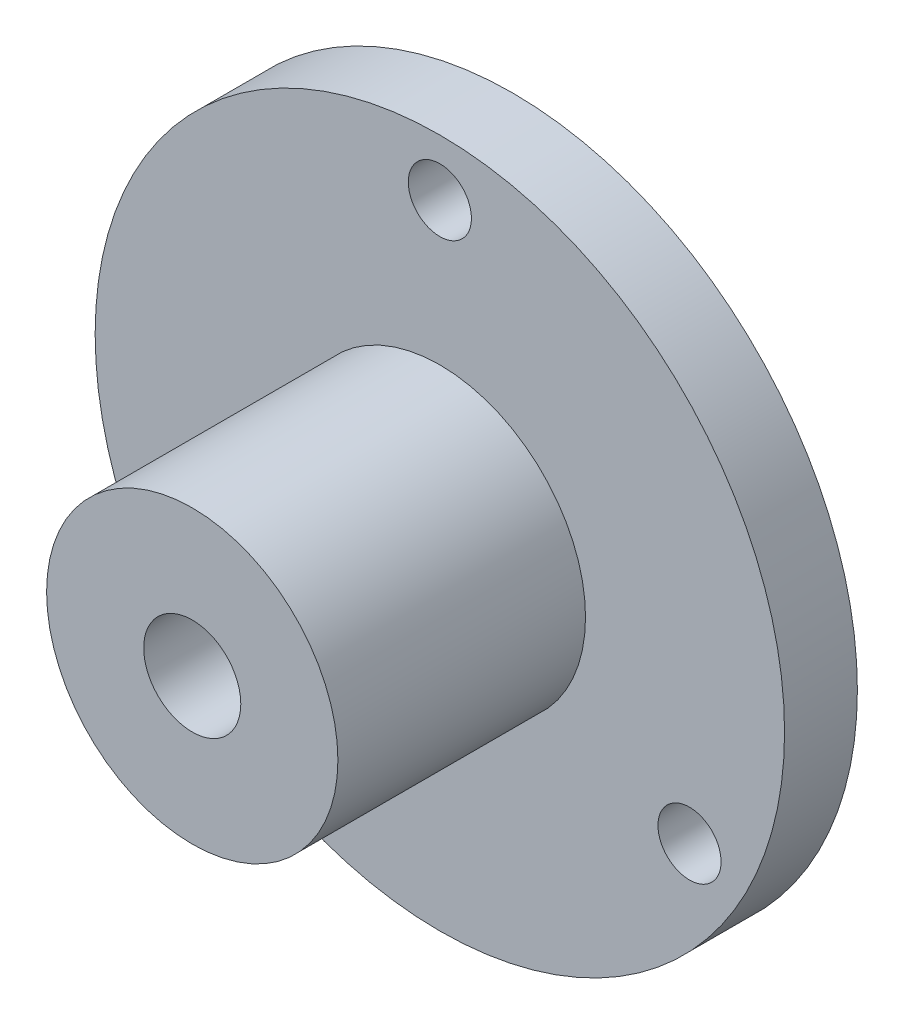
ISO-10303-21;
HEADER;
FILE_DESCRIPTION(('STEP AP214'),'2;1');
FILE_NAME('part.step','',(''),(''),'','','');
FILE_SCHEMA(('AUTOMOTIVE_DESIGN { 1 0 10303 214 1 1 1 1 }'));
ENDSEC;
DATA;
#1=APPLICATION_CONTEXT('core data for automotive mechanical design processes');
#2=APPLICATION_PROTOCOL_DEFINITION('international standard','automotive_design',2000,#1);
#3=PRODUCT_CONTEXT('',#1,'mechanical');
#4=PRODUCT('Part','Part','',(#3));
#5=PRODUCT_RELATED_PRODUCT_CATEGORY('part','',(#4));
#6=PRODUCT_DEFINITION_FORMATION('','',#4);
#7=PRODUCT_DEFINITION_CONTEXT('part definition',#1,'design');
#8=PRODUCT_DEFINITION('design','',#6,#7);
#9=PRODUCT_DEFINITION_SHAPE('','',#8);
#10=(LENGTH_UNIT() NAMED_UNIT(*) SI_UNIT(.MILLI.,.METRE.));
#11=(NAMED_UNIT(*) PLANE_ANGLE_UNIT() SI_UNIT($,.RADIAN.));
#12=(NAMED_UNIT(*) SI_UNIT($,.STERADIAN.) SOLID_ANGLE_UNIT());
#13=UNCERTAINTY_MEASURE_WITH_UNIT(LENGTH_MEASURE(1.E-05),#10,'distance_accuracy_value','');
#14=(GEOMETRIC_REPRESENTATION_CONTEXT(3) GLOBAL_UNCERTAINTY_ASSIGNED_CONTEXT((#13)) GLOBAL_UNIT_ASSIGNED_CONTEXT((#10,
#11,#12)) REPRESENTATION_CONTEXT('',''));
#15=CARTESIAN_POINT('',(0.,0.,0.));
#16=DIRECTION('',(0.,0.,1.));
#17=DIRECTION('',(1.,0.,0.));
#18=AXIS2_PLACEMENT_3D('',#15,#16,#17);
#19=CARTESIAN_POINT('',(0.,0.,6.));
#20=DIRECTION('',(0.,0.,-1.));
#21=DIRECTION('',(-1.,0.,0.));
#22=AXIS2_PLACEMENT_3D('',#19,#20,#21);
#23=CYLINDRICAL_SURFACE('',#22,28.4);
#24=CARTESIAN_POINT('',(0.,0.,6.));
#25=DIRECTION('',(0.,0.,1.));
#26=DIRECTION('',(1.,0.,0.));
#27=AXIS2_PLACEMENT_3D('',#24,#25,#26);
#28=CIRCLE('',#27,28.4);
#29=CARTESIAN_POINT('',(28.4,0.,6.));
#30=VERTEX_POINT('',#29);
#31=EDGE_CURVE('E48',#30,#30,#28,.T.);
#32=ORIENTED_EDGE('',*,*,#31,.F.);
#33=EDGE_LOOP('',(#32));
#34=FACE_BOUND('',#33,.T.);
#35=CARTESIAN_POINT('',(0.,0.,0.));
#36=DIRECTION('',(0.,0.,1.));
#37=DIRECTION('',(1.,0.,0.));
#38=AXIS2_PLACEMENT_3D('',#35,#36,#37);
#39=CIRCLE('',#38,28.4);
#40=CARTESIAN_POINT('',(28.4,0.,0.));
#41=VERTEX_POINT('',#40);
#42=EDGE_CURVE('E53',#41,#41,#39,.T.);
#43=ORIENTED_EDGE('',*,*,#42,.T.);
#44=EDGE_LOOP('',(#43));
#45=FACE_BOUND('',#44,.T.);
#46=ADVANCED_FACE('F36',(#34,#45),#23,.T.);
#47=CARTESIAN_POINT('',(0.,0.,6.));
#48=DIRECTION('',(0.,0.,1.));
#49=DIRECTION('',(1.,0.,0.));
#50=AXIS2_PLACEMENT_3D('',#47,#48,#49);
#51=PLANE('',#50);
#52=CARTESIAN_POINT('',(-20.5681033398804,-11.8750000000001,6.));
#53=DIRECTION('',(0.,0.,1.));
#54=DIRECTION('',(-0.500000000000004,0.866025403784436,0.));
#55=AXIS2_PLACEMENT_3D('',#52,#53,#54);
#56=CIRCLE('',#55,2.6);
#57=CARTESIAN_POINT('',(-21.8681033398804,-9.62333395016056,6.));
#58=VERTEX_POINT('',#57);
#59=EDGE_CURVE('E82',#58,#58,#56,.T.);
#60=ORIENTED_EDGE('',*,*,#59,.F.);
#61=EDGE_LOOP('',(#60));
#62=FACE_BOUND('',#61,.T.);
#63=CARTESIAN_POINT('',(20.5681033398805,-11.8749999999998,6.));
#64=DIRECTION('',(0.,0.,1.));
#65=DIRECTION('',(-0.499999999999992,-0.866025403784443,0.));
#66=AXIS2_PLACEMENT_3D('',#63,#64,#65);
#67=CIRCLE('',#66,2.6);
#68=CARTESIAN_POINT('',(19.2681033398806,-14.1266660498394,6.));
#69=VERTEX_POINT('',#68);
#70=EDGE_CURVE('E83',#69,#69,#67,.T.);
#71=ORIENTED_EDGE('',*,*,#70,.F.);
#72=EDGE_LOOP('',(#71));
#73=FACE_BOUND('',#72,.T.);
#74=CARTESIAN_POINT('',(0.,23.75,6.));
#75=DIRECTION('',(0.,0.,1.));
#76=DIRECTION('',(1.,0.,0.));
#77=AXIS2_PLACEMENT_3D('',#74,#75,#76);
#78=CIRCLE('',#77,2.6);
#79=CARTESIAN_POINT('',(2.6,23.75,6.));
#80=VERTEX_POINT('',#79);
#81=EDGE_CURVE('E71',#80,#80,#78,.T.);
#82=ORIENTED_EDGE('',*,*,#81,.F.);
#83=EDGE_LOOP('',(#82));
#84=FACE_BOUND('',#83,.T.);
#85=CARTESIAN_POINT('',(0.,0.,6.));
#86=DIRECTION('',(0.,0.,1.));
#87=DIRECTION('',(1.,0.,0.));
#88=AXIS2_PLACEMENT_3D('',#85,#86,#87);
#89=CIRCLE('',#88,12.);
#90=CARTESIAN_POINT('',(12.,0.,6.));
#91=VERTEX_POINT('',#90);
#92=EDGE_CURVE('E10',#91,#91,#89,.T.);
#93=ORIENTED_EDGE('',*,*,#92,.F.);
#94=EDGE_LOOP('',(#93));
#95=FACE_BOUND('',#94,.T.);
#96=ORIENTED_EDGE('',*,*,#31,.T.);
#97=EDGE_LOOP('',(#96));
#98=FACE_BOUND('',#97,.T.);
#99=ADVANCED_FACE('F131',(#62,#73,#84,#95,#98),#51,.T.);
#100=CARTESIAN_POINT('',(0.,0.,0.));
#101=DIRECTION('',(0.,0.,1.));
#102=DIRECTION('',(1.,0.,0.));
#103=AXIS2_PLACEMENT_3D('',#100,#101,#102);
#104=PLANE('',#103);
#105=CARTESIAN_POINT('',(-20.5681033398804,-11.8750000000001,0.));
#106=DIRECTION('',(0.,0.,-1.));
#107=DIRECTION('',(0.500000000000004,-0.866025403784436,0.));
#108=AXIS2_PLACEMENT_3D('',#105,#106,#107);
#109=CIRCLE('',#108,2.6);
#110=CARTESIAN_POINT('',(-19.2681033398804,-14.1266660498396,0.));
#111=VERTEX_POINT('',#110);
#112=EDGE_CURVE('E78',#111,#111,#109,.T.);
#113=ORIENTED_EDGE('',*,*,#112,.F.);
#114=EDGE_LOOP('',(#113));
#115=FACE_BOUND('',#114,.T.);
#116=CARTESIAN_POINT('',(20.5681033398805,-11.8749999999998,0.));
#117=DIRECTION('',(0.,0.,-1.));
#118=DIRECTION('',(0.499999999999992,0.866025403784443,0.));
#119=AXIS2_PLACEMENT_3D('',#116,#117,#118);
#120=CIRCLE('',#119,2.6);
#121=CARTESIAN_POINT('',(21.8681033398805,-9.62333395016026,0.));
#122=VERTEX_POINT('',#121);
#123=EDGE_CURVE('E79',#122,#122,#120,.T.);
#124=ORIENTED_EDGE('',*,*,#123,.F.);
#125=EDGE_LOOP('',(#124));
#126=FACE_BOUND('',#125,.T.);
#127=CARTESIAN_POINT('',(0.,23.75,0.));
#128=DIRECTION('',(0.,0.,-1.));
#129=DIRECTION('',(-1.,0.,0.));
#130=AXIS2_PLACEMENT_3D('',#127,#128,#129);
#131=CIRCLE('',#130,2.6);
#132=CARTESIAN_POINT('',(-2.6,23.75,0.));
#133=VERTEX_POINT('',#132);
#134=EDGE_CURVE('E75',#133,#133,#131,.T.);
#135=ORIENTED_EDGE('',*,*,#134,.F.);
#136=EDGE_LOOP('',(#135));
#137=FACE_BOUND('',#136,.T.);
#138=CARTESIAN_POINT('',(0.,0.,0.));
#139=DIRECTION('',(0.,0.,1.));
#140=DIRECTION('',(1.,0.,0.));
#141=AXIS2_PLACEMENT_3D('',#138,#139,#140);
#142=CIRCLE('',#141,4.);
#143=CARTESIAN_POINT('',(4.,0.,0.));
#144=VERTEX_POINT('',#143);
#145=EDGE_CURVE('E62',#144,#144,#142,.T.);
#146=ORIENTED_EDGE('',*,*,#145,.T.);
#147=EDGE_LOOP('',(#146));
#148=FACE_BOUND('',#147,.T.);
#149=ORIENTED_EDGE('',*,*,#42,.F.);
#150=EDGE_LOOP('',(#149));
#151=FACE_BOUND('',#150,.T.);
#152=ADVANCED_FACE('F127',(#115,#126,#137,#148,#151),#104,.F.);
#153=CARTESIAN_POINT('',(0.,0.,26.4));
#154=DIRECTION('',(0.,0.,-1.));
#155=DIRECTION('',(-1.,0.,0.));
#156=AXIS2_PLACEMENT_3D('',#153,#154,#155);
#157=CYLINDRICAL_SURFACE('',#156,12.);
#158=CARTESIAN_POINT('',(-12.,0.,18.7));
#159=CARTESIAN_POINT('',(-11.999997430533,-0.138818083403321,18.6999950450616));
#160=CARTESIAN_POINT('',(-11.9975665755009,-0.277697579041751,18.6883986685625));
#161=CARTESIAN_POINT('',(-11.9881040198136,-0.551522632533986,18.6423613009343));
#162=CARTESIAN_POINT('',(-11.981068823785,-0.686465120256625,18.6079029539261));
#163=CARTESIAN_POINT('',(-11.963182183924,-0.948418264582684,18.5172590901564));
#164=CARTESIAN_POINT('',(-11.9523345410529,-1.07543667341837,18.4610952080022));
#165=CARTESIAN_POINT('',(-11.9279985561972,-1.31824065721192,18.3287007822876));
#166=CARTESIAN_POINT('',(-11.9145103325195,-1.43402673506865,18.2524711376883));
#167=CARTESIAN_POINT('',(-11.886154000493,-1.65278064861767,18.0809273196187));
#168=CARTESIAN_POINT('',(-11.8712701169706,-1.75556048832537,17.9853759975298));
#169=CARTESIAN_POINT('',(-11.841913153849,-1.94375555353878,17.7784106816098));
#170=CARTESIAN_POINT('',(-11.8274401083337,-2.02916934192198,17.6669953762555));
#171=CARTESIAN_POINT('',(-11.8003888519062,-2.18102063354434,17.4300960624677));
#172=CARTESIAN_POINT('',(-11.7878309034966,-2.24726109361302,17.3044832309945));
#173=CARTESIAN_POINT('',(-11.7662568130004,-2.35762238696128,17.0436050964545));
#174=CARTESIAN_POINT('',(-11.7572402893514,-2.40174560335283,16.9083408351149));
#175=CARTESIAN_POINT('',(-11.7439300197225,-2.46600480267474,16.6340295251687));
#176=CARTESIAN_POINT('',(-11.7395711371173,-2.48647195393598,16.4950632813305));
#177=CARTESIAN_POINT('',(-11.7358738143298,-2.50386715311229,16.2156063142747));
#178=CARTESIAN_POINT('',(-11.7365348160196,-2.50079781789374,16.0751157622694));
#179=CARTESIAN_POINT('',(-11.7427434863835,-2.47147438074394,15.7990379440496));
#180=CARTESIAN_POINT('',(-11.748210673598,-2.44560210465441,15.6634080406776));
#181=CARTESIAN_POINT('',(-11.7632887523188,-2.3720108705989,15.3984569807101));
#182=CARTESIAN_POINT('',(-11.7728998568263,-2.32429078962764,15.2691361487873));
#183=CARTESIAN_POINT('',(-11.795263829282,-2.20800006427857,15.019385543168));
#184=CARTESIAN_POINT('',(-11.8080390757117,-2.13928005068474,14.8990274069459));
#185=CARTESIAN_POINT('',(-11.8352778002144,-1.98304539854964,14.6714085114637));
#186=CARTESIAN_POINT('',(-11.8497414879707,-1.89552842452518,14.564149382328));
#187=CARTESIAN_POINT('',(-11.8790746185982,-1.70214984309357,14.3635720778393));
#188=CARTESIAN_POINT('',(-11.8939464639895,-1.59596286682417,14.270567662206));
#189=CARTESIAN_POINT('',(-11.92216176286,-1.3693345772236,14.1036391155421));
#190=CARTESIAN_POINT('',(-11.9355051934047,-1.24889305005153,14.0297152708032));
#191=CARTESIAN_POINT('',(-11.9591974188563,-0.996811082470959,13.9029798369281));
#192=CARTESIAN_POINT('',(-11.9695407942052,-0.865150923853001,13.8502063908658));
#193=CARTESIAN_POINT('',(-11.9860267642256,-0.594569241944312,13.767616590329));
#194=CARTESIAN_POINT('',(-11.9921699119211,-0.45564867719018,13.7377972135372));
#195=CARTESIAN_POINT('',(-11.9994855043091,-0.177183731401671,13.7024114958642));
#196=CARTESIAN_POINT('',(-12.0007458707516,-0.0376961110523583,13.6964161170115));
#197=CARTESIAN_POINT('',(-11.9983990450555,0.240287597515428,13.7076898999382));
#198=CARTESIAN_POINT('',(-11.9947921509631,0.378783745924515,13.7249576372032));
#199=CARTESIAN_POINT('',(-11.9831712995837,0.649452734239625,13.7819113069391));
#200=CARTESIAN_POINT('',(-11.9752010573615,0.781674385788412,13.8213749707669));
#201=CARTESIAN_POINT('',(-11.9557445448479,1.03762289332266,13.9213557208428));
#202=CARTESIAN_POINT('',(-11.9442579948916,1.16134907267355,13.981874481732));
#203=CARTESIAN_POINT('',(-11.9188248298143,1.39858861388699,14.1231607564751));
#204=CARTESIAN_POINT('',(-11.9048478762466,1.51194643893967,14.2041838591381));
#205=CARTESIAN_POINT('',(-11.8760513659942,1.72361089177304,14.3838391261525));
#206=CARTESIAN_POINT('',(-11.8612317108502,1.82191575582657,14.4824733510379));
#207=CARTESIAN_POINT('',(-11.8321204906275,2.0023572973036,14.6965111539994));
#208=CARTESIAN_POINT('',(-11.81784178615,2.08419829200409,14.8121660639106));
#209=CARTESIAN_POINT('',(-11.7917120203161,2.22729438158487,15.0558325684276));
#210=CARTESIAN_POINT('',(-11.779860857893,2.28855033355728,15.1838436482782));
#211=CARTESIAN_POINT('',(-11.7600340141608,2.38834492887844,15.4479223925965));
#212=CARTESIAN_POINT('',(-11.7520374556937,2.42700619656063,15.5839420743317));
#213=CARTESIAN_POINT('',(-11.7407836941939,2.48088077046815,15.8607331009845));
#214=CARTESIAN_POINT('',(-11.7375258132073,2.49609743088882,16.0015037632389));
#215=CARTESIAN_POINT('',(-11.7361581461701,2.50251852975223,16.2808268019993));
#216=CARTESIAN_POINT('',(-11.73794804643,2.49419085245451,16.4193681404441));
#217=CARTESIAN_POINT('',(-11.7462489450985,2.45479810628063,16.6930280178404));
#218=CARTESIAN_POINT('',(-11.7527598981925,2.42373325564532,16.8281465896322));
#219=CARTESIAN_POINT('',(-11.7697226489543,2.3399643553717,17.0907955437813));
#220=CARTESIAN_POINT('',(-11.7801631401586,2.28732235136843,17.2183464929738));
#221=CARTESIAN_POINT('',(-11.8038141147748,2.16194914599515,17.4628775520533));
#222=CARTESIAN_POINT('',(-11.8170248553092,2.0892160796606,17.5798566792662));
#223=CARTESIAN_POINT('',(-11.8450315910229,1.92414739068482,17.8022432541589));
#224=CARTESIAN_POINT('',(-11.8598522773681,1.83147578083645,17.90739824913));
#225=CARTESIAN_POINT('',(-11.8892367916643,1.62984887623067,18.1008189864527));
#226=CARTESIAN_POINT('',(-11.9038005596976,1.52088983766594,18.189080835103));
#227=CARTESIAN_POINT('',(-11.9312288909528,1.28826885501541,18.3471771463681));
#228=CARTESIAN_POINT('',(-11.9440719214649,1.1644518430427,18.4167873597726));
#229=CARTESIAN_POINT('',(-11.9663981698818,0.90663968799691,18.53410045686));
#230=CARTESIAN_POINT('',(-11.975884323642,0.772653563814489,18.5818224943637));
#231=CARTESIAN_POINT('',(-11.9886499956289,0.532030585800212,18.6450805565768));
#232=CARTESIAN_POINT('',(-11.9928807132279,0.426735187455859,18.6656375264177));
#233=CARTESIAN_POINT('',(-11.9985566557952,0.214305348353074,18.6930989085547));
#234=CARTESIAN_POINT('',(-12.0000019836917,0.107170975697744,18.7000038253344));
#235=CARTESIAN_POINT('',(-12.,0.,18.7));
#236=B_SPLINE_CURVE_WITH_KNOTS('',3,(#158,#159,#160,#161,#162,#163,#164,#165,#166,#167,#168,
#169,#170,#171,#172,#173,#174,#175,#176,#177,#178,#179,#180,#181,#182,#183,#184,#185,#186,#187,
#188,#189,#190,#191,#192,#193,#194,#195,#196,#197,#198,#199,#200,#201,#202,#203,#204,#205,#206,
#207,#208,#209,#210,#211,#212,#213,#214,#215,#216,#217,#218,#219,#220,#221,#222,#223,#224,#225,
#226,#227,#228,#229,#230,#231,#232,#233,#234,#235),.UNSPECIFIED.,.T.,.F.,(4,2,2,2,2,2,2,2,2,2,2,
2,2,2,2,2,2,2,2,2,2,2,2,2,2,2,2,2,2,2,2,2,2,2,2,2,2,2,4),(0.,0.416062090206366,
0.832440399812449,1.24840475765088,1.66435048314598,2.08575052776245,2.50718543103572,
2.93280898357097,3.35838666570981,3.77793150339709,4.19742969534329,4.61003424258119,
5.0226600006056,5.43829184833498,5.85397536736069,6.27779052710932,6.70161204556436,
7.12619448999325,7.55072102091543,7.96756678815351,8.38438703104555,8.79710573265244,
9.20985726781867,9.62803167991474,10.0462550512915,10.4714252765867,10.8965777970262,
11.3194010019005,11.7421637082837,12.1565844658208,12.5710012456272,12.9842346278651,
13.3975063816296,13.8183804966062,14.2393515023474,14.6651772879651,15.0906297292995,
15.4118517695456,15.7330619394678),.UNSPECIFIED.);
#237=CARTESIAN_POINT('',(-12.,0.,18.7));
#238=VERTEX_POINT('',#237);
#239=EDGE_CURVE('E86',#238,#238,#236,.T.);
#240=ORIENTED_EDGE('',*,*,#239,.T.);
#241=EDGE_LOOP('',(#240));
#242=FACE_BOUND('',#241,.T.);
#243=CARTESIAN_POINT('',(0.,0.,26.4));
#244=DIRECTION('',(0.,0.,1.));
#245=DIRECTION('',(1.,0.,0.));
#246=AXIS2_PLACEMENT_3D('',#243,#244,#245);
#247=CIRCLE('',#246,12.);
#248=CARTESIAN_POINT('',(12.,0.,26.4));
#249=VERTEX_POINT('',#248);
#250=EDGE_CURVE('E56',#249,#249,#247,.T.);
#251=ORIENTED_EDGE('',*,*,#250,.F.);
#252=EDGE_LOOP('',(#251));
#253=FACE_BOUND('',#252,.T.);
#254=ORIENTED_EDGE('',*,*,#92,.T.);
#255=EDGE_LOOP('',(#254));
#256=FACE_BOUND('',#255,.T.);
#257=ADVANCED_FACE('F96',(#242,#253,#256),#157,.T.);
#258=CARTESIAN_POINT('',(0.,0.,26.4));
#259=DIRECTION('',(0.,0.,1.));
#260=DIRECTION('',(1.,0.,0.));
#261=AXIS2_PLACEMENT_3D('',#258,#259,#260);
#262=PLANE('',#261);
#263=CARTESIAN_POINT('',(0.,0.,26.4));
#264=DIRECTION('',(0.,0.,1.));
#265=DIRECTION('',(1.,0.,0.));
#266=AXIS2_PLACEMENT_3D('',#263,#264,#265);
#267=CIRCLE('',#266,4.);
#268=CARTESIAN_POINT('',(4.,0.,26.4));
#269=VERTEX_POINT('',#268);
#270=EDGE_CURVE('E66',#269,#269,#267,.T.);
#271=ORIENTED_EDGE('',*,*,#270,.F.);
#272=EDGE_LOOP('',(#271));
#273=FACE_BOUND('',#272,.T.);
#274=ORIENTED_EDGE('',*,*,#250,.T.);
#275=EDGE_LOOP('',(#274));
#276=FACE_BOUND('',#275,.T.);
#277=ADVANCED_FACE('F120',(#273,#276),#262,.T.);
#278=CARTESIAN_POINT('',(0.,0.,0.));
#279=DIRECTION('',(0.,0.,1.));
#280=DIRECTION('',(1.,0.,0.));
#281=AXIS2_PLACEMENT_3D('',#278,#279,#280);
#282=CYLINDRICAL_SURFACE('',#281,4.);
#283=CARTESIAN_POINT('',(-4.,0.,13.7));
#284=CARTESIAN_POINT('',(-3.99999041333571,-0.127017476559871,13.7000104761436));
#285=CARTESIAN_POINT('',(-3.9938860659399,-0.254191951791703,13.7097464999017));
#286=CARTESIAN_POINT('',(-3.97004375552586,-0.504637456621344,13.7481711296843));
#287=CARTESIAN_POINT('',(-3.95228361873137,-0.627900575825985,13.7768958602612));
#288=CARTESIAN_POINT('',(-3.90691695293563,-0.866410868269162,13.8516228532875));
#289=CARTESIAN_POINT('',(-3.87935918690877,-0.98169442070943,13.8975396097876));
#290=CARTESIAN_POINT('',(-3.81669199838277,-1.20252080434995,14.0047716674915));
#291=CARTESIAN_POINT('',(-3.7815834126609,-1.30806471304098,14.0660852625531));
#292=CARTESIAN_POINT('',(-3.70340304945466,-1.51594836437078,14.2077731565911));
#293=CARTESIAN_POINT('',(-3.65991924217889,-1.61735911616791,14.2892786027018));
#294=CARTESIAN_POINT('',(-3.57062700058922,-1.80597275567284,14.4664383462585));
#295=CARTESIAN_POINT('',(-3.52481549782957,-1.89315621594405,14.5621116557389));
#296=CARTESIAN_POINT('',(-3.42860837235627,-2.06285746302521,14.7800677892912));
#297=CARTESIAN_POINT('',(-3.37843221966147,-2.14314412018317,14.9041995734309));
#298=CARTESIAN_POINT('',(-3.28660396278105,-2.28147932079995,15.1671296306783));
#299=CARTESIAN_POINT('',(-3.2449375200046,-2.33956541787438,15.305902625168));
#300=CARTESIAN_POINT('',(-3.18619151248815,-2.41866801180576,15.5576210475457));
#301=CARTESIAN_POINT('',(-3.16553811970886,-2.44539104794679,15.6679336369183));
#302=CARTESIAN_POINT('',(-3.1356271466086,-2.4836368711914,15.8926118513807));
#303=CARTESIAN_POINT('',(-3.12635347378457,-2.49518112485638,16.0069715171732));
#304=CARTESIAN_POINT('',(-3.12059771534501,-2.50237836690497,16.2368260328764));
#305=CARTESIAN_POINT('',(-3.12414917427958,-2.49798968200884,16.352323070578));
#306=CARTESIAN_POINT('',(-3.14354804883411,-2.47352633347829,16.5806202087266));
#307=CARTESIAN_POINT('',(-3.15940531965489,-2.45343909745149,16.6934180728499));
#308=CARTESIAN_POINT('',(-3.20065145822146,-2.3993620946426,16.9108768967436));
#309=CARTESIAN_POINT('',(-3.22581428653572,-2.36570043522604,17.0156648797174));
#310=CARTESIAN_POINT('',(-3.28291134443418,-2.28580369589507,17.2183223964732));
#311=CARTESIAN_POINT('',(-3.31484796808523,-2.2395641689404,17.3161894678435));
#312=CARTESIAN_POINT('',(-3.38909625095658,-2.12589830407261,17.5216664075102));
#313=CARTESIAN_POINT('',(-3.43223155208551,-2.05612773657746,17.6276810518524));
#314=CARTESIAN_POINT('',(-3.52011451554715,-1.90176111958637,17.8276611269764));
#315=CARTESIAN_POINT('',(-3.56486379714022,-1.8171498325134,17.9216140000451));
#316=CARTESIAN_POINT('',(-3.65959667460597,-1.61904732877734,18.1106010095826));
#317=CARTESIAN_POINT('',(-3.70922571443728,-1.50309447420016,18.2032559427216));
#318=CARTESIAN_POINT('',(-3.8005660184067,-1.25426444468514,18.367711793631));
#319=CARTESIAN_POINT('',(-3.84228039228673,-1.12139395127005,18.4395209078095));
#320=CARTESIAN_POINT('',(-3.89435975869902,-0.915775751567437,18.527345956635));
#321=CARTESIAN_POINT('',(-3.90966874385268,-0.848193583187388,18.5528342864304));
#322=CARTESIAN_POINT('',(-3.93701839875445,-0.710492049478441,18.5980076504786));
#323=CARTESIAN_POINT('',(-3.94906095588034,-0.640374175967895,18.6176960365708));
#324=CARTESIAN_POINT('',(-3.96949699527849,-0.498239019538468,18.6509341616424));
#325=CARTESIAN_POINT('',(-3.97789374843884,-0.426223500915271,18.664489403526));
#326=CARTESIAN_POINT('',(-3.99078766491331,-0.280965673560728,18.6852462933136));
#327=CARTESIAN_POINT('',(-3.99528549435853,-0.207723576570748,18.6924490265473));
#328=CARTESIAN_POINT('',(-4.00193773474167,-0.00911917689680277,18.7031093046435));
#329=CARTESIAN_POINT('',(-4.000238122366,0.116782016705697,18.7004003631235));
#330=CARTESIAN_POINT('',(-3.98518313408306,0.365967766011669,18.6762403355346));
#331=CARTESIAN_POINT('',(-3.97182855210102,0.489252499359952,18.6547905260753));
#332=CARTESIAN_POINT('',(-3.93547975555369,0.725036194002604,18.5955214120172));
#333=CARTESIAN_POINT('',(-3.91288306371126,0.837768421062915,18.5583752792302));
#334=CARTESIAN_POINT('',(-3.85991402897874,1.05527816125332,18.4694076286876));
#335=CARTESIAN_POINT('',(-3.82954038411642,1.160054338616,18.4175836534986));
#336=CARTESIAN_POINT('',(-3.75980014020658,1.37016761969194,18.2949694624922));
#337=CARTESIAN_POINT('',(-3.71983526755373,1.47449380296905,18.222792827725));
#338=CARTESIAN_POINT('',(-3.63613942885727,1.67028541330073,18.0644123035307));
#339=CARTESIAN_POINT('',(-3.59240430473134,1.76173634038025,17.9781928311143));
#340=CARTESIAN_POINT('',(-3.49811738486729,1.94294835276253,17.7797299101543));
#341=CARTESIAN_POINT('',(-3.44749766579191,2.03053702733638,17.6655255845025));
#342=CARTESIAN_POINT('',(-3.35133525746893,2.18560704916439,17.4222484330174));
#343=CARTESIAN_POINT('',(-3.30578906708369,2.25310231693768,17.2931859871087));
#344=CARTESIAN_POINT('',(-3.23467060578839,2.35369543821019,17.0506157034004));
#345=CARTESIAN_POINT('',(-3.20691272363805,2.39103791720685,16.9395184986113));
#346=CARTESIAN_POINT('',(-3.16210061351252,2.45000216420748,16.7112137083865));
#347=CARTESIAN_POINT('',(-3.1450296652982,2.47164849805251,16.5940159803106));
#348=CARTESIAN_POINT('',(-3.124126499326,2.49802767469226,16.3558194470296));
#349=CARTESIAN_POINT('',(-3.12037003193165,2.50266374586469,16.2348028321201));
#350=CARTESIAN_POINT('',(-3.12698126375719,2.49439556773531,15.9937380761705));
#351=CARTESIAN_POINT('',(-3.13735365770479,2.48148548821457,15.8736902703806));
#352=CARTESIAN_POINT('',(-3.16910777009989,2.44076547086104,15.6479404205639));
#353=CARTESIAN_POINT('',(-3.18953614189074,2.41423847191721,15.5418614354976));
#354=CARTESIAN_POINT('',(-3.23835062785226,2.34835238743426,15.3357298424817));
#355=CARTESIAN_POINT('',(-3.26674005971309,2.3089879509078,15.2356797681827));
#356=CARTESIAN_POINT('',(-3.33327797617852,2.21205415803959,15.0288066756619));
#357=CARTESIAN_POINT('',(-3.3722442852408,2.15267427981667,14.9231000537363));
#358=CARTESIAN_POINT('',(-3.45335445323995,2.01999894889208,14.7221226142907));
#359=CARTESIAN_POINT('',(-3.49550086438999,1.94669224594686,14.6268603326259));
#360=CARTESIAN_POINT('',(-3.58803675426846,1.77134669685941,14.4299744162016));
#361=CARTESIAN_POINT('',(-3.63840488260278,1.66649284489892,14.3308302384607));
#362=CARTESIAN_POINT('',(-3.7339805383823,1.43961937990848,14.1509984038749));
#363=CARTESIAN_POINT('',(-3.77918486147258,1.3175892119665,14.0703221763225));
#364=CARTESIAN_POINT('',(-3.83959214728415,1.12346357942551,13.9654365614412));
#365=CARTESIAN_POINT('',(-3.85851834157058,1.05679601158094,13.933125199953));
#366=CARTESIAN_POINT('',(-3.89335165397882,0.920199584374059,13.8743277481762));
#367=CARTESIAN_POINT('',(-3.90926051225921,0.850272633931981,13.8478382988649));
#368=CARTESIAN_POINT('',(-3.93753374175517,0.707873688437763,13.8011428555378));
#369=CARTESIAN_POINT('',(-3.94990764965183,0.635409144572261,13.7809199427543));
#370=CARTESIAN_POINT('',(-3.97075677458059,0.488456989557112,13.7470245444176));
#371=CARTESIAN_POINT('',(-3.97923486692924,0.413970913545525,13.7333472275605));
#372=CARTESIAN_POINT('',(-3.99038271291772,0.282852605094048,13.7154095897733));
#373=CARTESIAN_POINT('',(-3.99398159517595,0.226501515914867,13.7096384697478));
#374=CARTESIAN_POINT('',(-3.99879245372932,0.113444074519046,13.7019312163728));
#375=CARTESIAN_POINT('',(-4.00000428228699,0.0567377005313052,13.6999953203896));
#376=CARTESIAN_POINT('',(-4.,0.,13.7));
#377=B_SPLINE_CURVE_WITH_KNOTS('',3,(#283,#284,#285,#286,#287,#288,#289,#290,#291,#292,#293,
#294,#295,#296,#297,#298,#299,#300,#301,#302,#303,#304,#305,#306,#307,#308,#309,#310,#311,#312,
#313,#314,#315,#316,#317,#318,#319,#320,#321,#322,#323,#324,#325,#326,#327,#328,#329,#330,#331,
#332,#333,#334,#335,#336,#337,#338,#339,#340,#341,#342,#343,#344,#345,#346,#347,#348,#349,#350,
#351,#352,#353,#354,#355,#356,#357,#358,#359,#360,#361,#362,#363,#364,#365,#366,#367,#368,#369,
#370,#371,#372,#373,#374,#375,#376),.UNSPECIFIED.,.T.,.F.,(4,2,2,2,2,2,2,2,2,2,2,2,2,2,2,2,2,2,
2,2,2,2,2,2,2,2,2,2,2,2,2,2,2,2,2,2,2,2,2,2,2,2,2,2,2,2,4),(0.,0.380824602868265,
0.762375788256924,1.14205397519027,1.52169010807759,1.93164374107244,2.34215256651403,
2.80825951705947,3.27357449214021,3.61824017759434,3.96241789414782,4.30749646997557,
4.65285169010167,4.99031678920874,5.32790135816066,5.7285490070872,6.12961045150364,
6.59684361399044,7.06389281455723,7.28510978359956,7.50619865744383,7.72708876613708,
7.94794112831294,8.32363778110178,8.69930884379594,9.06028425977629,9.42132014771965,
9.81879878896138,10.216721545704,10.6724083464246,11.1277787130885,11.4876929754247,
11.8470427174174,12.2084336629143,12.5699447204276,12.9023575499051,13.2349091154192,
13.6156046298899,13.9966089922257,14.4531049498526,14.9098826607203,15.1389848639481,
15.3679545348469,15.5963005225023,15.8244777070605,15.994578512822,16.1646898459841),.UNSPECIFIED.);
#378=CARTESIAN_POINT('',(-4.,0.,13.7));
#379=VERTEX_POINT('',#378);
#380=EDGE_CURVE('E39',#379,#379,#377,.T.);
#381=ORIENTED_EDGE('',*,*,#380,.T.);
#382=EDGE_LOOP('',(#381));
#383=FACE_BOUND('',#382,.T.);
#384=ORIENTED_EDGE('',*,*,#145,.F.);
#385=EDGE_LOOP('',(#384));
#386=FACE_BOUND('',#385,.T.);
#387=ORIENTED_EDGE('',*,*,#270,.T.);
#388=EDGE_LOOP('',(#387));
#389=FACE_BOUND('',#388,.T.);
#390=ADVANCED_FACE('F116',(#383,#386,#389),#282,.F.);
#391=CARTESIAN_POINT('',(0.,23.75,26.4));
#392=DIRECTION('',(0.,0.,-1.));
#393=DIRECTION('',(-1.,0.,0.));
#394=AXIS2_PLACEMENT_3D('',#391,#392,#393);
#395=CYLINDRICAL_SURFACE('',#394,2.6);
#396=ORIENTED_EDGE('',*,*,#81,.T.);
#397=EDGE_LOOP('',(#396));
#398=FACE_BOUND('',#397,.T.);
#399=ORIENTED_EDGE('',*,*,#134,.T.);
#400=EDGE_LOOP('',(#399));
#401=FACE_BOUND('',#400,.T.);
#402=ADVANCED_FACE('F113',(#398,#401),#395,.F.);
#403=CARTESIAN_POINT('',(20.5681033398805,-11.8749999999998,26.4));
#404=DIRECTION('',(0.,0.,-1.));
#405=DIRECTION('',(0.499999999999992,0.866025403784443,0.));
#406=AXIS2_PLACEMENT_3D('',#403,#404,#405);
#407=CYLINDRICAL_SURFACE('',#406,2.6);
#408=ORIENTED_EDGE('',*,*,#70,.T.);
#409=EDGE_LOOP('',(#408));
#410=FACE_BOUND('',#409,.T.);
#411=ORIENTED_EDGE('',*,*,#123,.T.);
#412=EDGE_LOOP('',(#411));
#413=FACE_BOUND('',#412,.T.);
#414=ADVANCED_FACE('F109',(#410,#413),#407,.F.);
#415=CARTESIAN_POINT('',(-20.5681033398804,-11.8750000000001,26.4));
#416=DIRECTION('',(0.,0.,-1.));
#417=DIRECTION('',(0.500000000000004,-0.866025403784436,0.));
#418=AXIS2_PLACEMENT_3D('',#415,#416,#417);
#419=CYLINDRICAL_SURFACE('',#418,2.6);
#420=ORIENTED_EDGE('',*,*,#59,.T.);
#421=EDGE_LOOP('',(#420));
#422=FACE_BOUND('',#421,.T.);
#423=ORIENTED_EDGE('',*,*,#112,.T.);
#424=EDGE_LOOP('',(#423));
#425=FACE_BOUND('',#424,.T.);
#426=ADVANCED_FACE('F104',(#422,#425),#419,.F.);
#427=CARTESIAN_POINT('',(-28.4,0.,16.2));
#428=DIRECTION('',(1.,0.,0.));
#429=DIRECTION('',(0.,0.,-1.));
#430=AXIS2_PLACEMENT_3D('',#427,#428,#429);
#431=CYLINDRICAL_SURFACE('',#430,2.5);
#432=ORIENTED_EDGE('',*,*,#380,.F.);
#433=EDGE_LOOP('',(#432));
#434=FACE_BOUND('',#433,.T.);
#435=ORIENTED_EDGE('',*,*,#239,.F.);
#436=EDGE_LOOP('',(#435));
#437=FACE_BOUND('',#436,.T.);
#438=ADVANCED_FACE('F100',(#434,#437),#431,.F.);
#439=CLOSED_SHELL('',(#46,#99,#152,#257,#277,#390,#402,#414,#426,#438));
#440=MANIFOLD_SOLID_BREP('B2',#439);
#441=ADVANCED_BREP_SHAPE_REPRESENTATION('',(#18,#440),#14);
#442=SHAPE_DEFINITION_REPRESENTATION(#9,#441);
ENDSEC;
END-ISO-10303-21;
